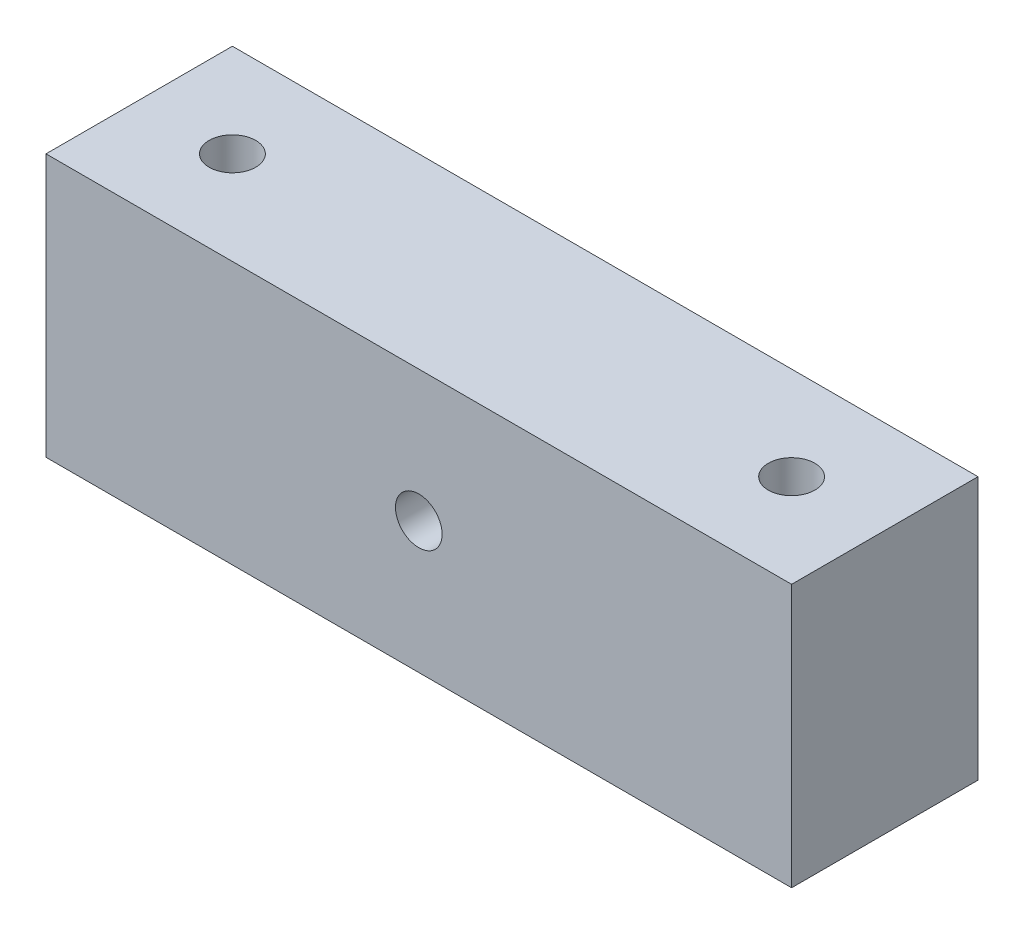
ISO-10303-21;
HEADER;
FILE_DESCRIPTION(('STEP AP214'),'2;1');
FILE_NAME('part.step','',(''),(''),'','','');
FILE_SCHEMA(('AUTOMOTIVE_DESIGN { 1 0 10303 214 1 1 1 1 }'));
ENDSEC;
DATA;
#1=APPLICATION_CONTEXT('core data for automotive mechanical design processes');
#2=APPLICATION_PROTOCOL_DEFINITION('international standard','automotive_design',2000,#1);
#3=PRODUCT_CONTEXT('',#1,'mechanical');
#4=PRODUCT('Part','Part','',(#3));
#5=PRODUCT_RELATED_PRODUCT_CATEGORY('part','',(#4));
#6=PRODUCT_DEFINITION_FORMATION('','',#4);
#7=PRODUCT_DEFINITION_CONTEXT('part definition',#1,'design');
#8=PRODUCT_DEFINITION('design','',#6,#7);
#9=PRODUCT_DEFINITION_SHAPE('','',#8);
#10=(LENGTH_UNIT() NAMED_UNIT(*) SI_UNIT(.MILLI.,.METRE.));
#11=(NAMED_UNIT(*) PLANE_ANGLE_UNIT() SI_UNIT($,.RADIAN.));
#12=(NAMED_UNIT(*) SI_UNIT($,.STERADIAN.) SOLID_ANGLE_UNIT());
#13=UNCERTAINTY_MEASURE_WITH_UNIT(LENGTH_MEASURE(1.E-05),#10,'distance_accuracy_value','');
#14=(GEOMETRIC_REPRESENTATION_CONTEXT(3) GLOBAL_UNCERTAINTY_ASSIGNED_CONTEXT((#13)) GLOBAL_UNIT_ASSIGNED_CONTEXT((#10,
#11,#12)) REPRESENTATION_CONTEXT('',''));
#15=CARTESIAN_POINT('',(0.,0.,0.));
#16=DIRECTION('',(0.,0.,1.));
#17=DIRECTION('',(1.,0.,0.));
#18=AXIS2_PLACEMENT_3D('',#15,#16,#17);
#19=CARTESIAN_POINT('',(0.,14.1,0.));
#20=DIRECTION('',(1.,0.,0.));
#21=DIRECTION('',(0.,0.,1.));
#22=AXIS2_PLACEMENT_3D('',#19,#20,#21);
#23=PLANE('',#22);
#24=DIRECTION('',(0.,0.,-1.));
#25=VECTOR('',#24,1.);
#26=CARTESIAN_POINT('',(0.,0.,0.));
#27=LINE('',#26,#25);
#28=CARTESIAN_POINT('',(0.,0.,10.));
#29=VERTEX_POINT('',#28);
#30=CARTESIAN_POINT('',(0.,0.,0.));
#31=VERTEX_POINT('',#30);
#32=EDGE_CURVE('E101',#29,#31,#27,.T.);
#33=ORIENTED_EDGE('',*,*,#32,.F.);
#34=DIRECTION('',(0.,-1.,0.));
#35=VECTOR('',#34,1.);
#36=CARTESIAN_POINT('',(0.,14.1,10.));
#37=LINE('',#36,#35);
#38=CARTESIAN_POINT('',(0.,14.1,10.));
#39=VERTEX_POINT('',#38);
#40=EDGE_CURVE('E100',#39,#29,#37,.T.);
#41=ORIENTED_EDGE('',*,*,#40,.F.);
#42=DIRECTION('',(0.,0.,-1.));
#43=VECTOR('',#42,1.);
#44=CARTESIAN_POINT('',(0.,14.1,0.));
#45=LINE('',#44,#43);
#46=CARTESIAN_POINT('',(0.,14.1,0.));
#47=VERTEX_POINT('',#46);
#48=EDGE_CURVE('E94',#39,#47,#45,.T.);
#49=ORIENTED_EDGE('',*,*,#48,.T.);
#50=DIRECTION('',(0.,-1.,0.));
#51=VECTOR('',#50,1.);
#52=CARTESIAN_POINT('',(0.,14.1,0.));
#53=LINE('',#52,#51);
#54=EDGE_CURVE('E11',#47,#31,#53,.T.);
#55=ORIENTED_EDGE('',*,*,#54,.T.);
#56=EDGE_LOOP('',(#33,#41,#49,#55));
#57=FACE_BOUND('',#56,.T.);
#58=ADVANCED_FACE('F37',(#57),#23,.F.);
#59=CARTESIAN_POINT('',(0.,14.1,0.));
#60=DIRECTION('',(0.,0.,1.));
#61=DIRECTION('',(-1.,0.,0.));
#62=AXIS2_PLACEMENT_3D('',#59,#60,#61);
#63=PLANE('',#62);
#64=CARTESIAN_POINT('',(20.,7.05,0.));
#65=DIRECTION('',(0.,0.,-1.));
#66=DIRECTION('',(-1.,0.,0.));
#67=AXIS2_PLACEMENT_3D('',#64,#65,#66);
#68=CIRCLE('',#67,1.25);
#69=CARTESIAN_POINT('',(18.75,7.05,0.));
#70=VERTEX_POINT('',#69);
#71=EDGE_CURVE('E135',#70,#70,#68,.T.);
#72=ORIENTED_EDGE('',*,*,#71,.F.);
#73=EDGE_LOOP('',(#72));
#74=FACE_BOUND('',#73,.T.);
#75=DIRECTION('',(1.,0.,0.));
#76=VECTOR('',#75,1.);
#77=CARTESIAN_POINT('',(0.,0.,0.));
#78=LINE('',#77,#76);
#79=CARTESIAN_POINT('',(40.,0.,0.));
#80=VERTEX_POINT('',#79);
#81=EDGE_CURVE('E103',#31,#80,#78,.T.);
#82=ORIENTED_EDGE('',*,*,#81,.F.);
#83=ORIENTED_EDGE('',*,*,#54,.F.);
#84=DIRECTION('',(1.,0.,0.));
#85=VECTOR('',#84,1.);
#86=CARTESIAN_POINT('',(0.,14.1,0.));
#87=LINE('',#86,#85);
#88=CARTESIAN_POINT('',(40.,14.1,0.));
#89=VERTEX_POINT('',#88);
#90=EDGE_CURVE('E78',#47,#89,#87,.T.);
#91=ORIENTED_EDGE('',*,*,#90,.T.);
#92=DIRECTION('',(0.,-1.,0.));
#93=VECTOR('',#92,1.);
#94=CARTESIAN_POINT('',(40.,14.1,0.));
#95=LINE('',#94,#93);
#96=EDGE_CURVE('E45',#89,#80,#95,.T.);
#97=ORIENTED_EDGE('',*,*,#96,.T.);
#98=EDGE_LOOP('',(#82,#83,#91,#97));
#99=FACE_BOUND('',#98,.T.);
#100=ADVANCED_FACE('F92',(#74,#99),#63,.F.);
#101=CARTESIAN_POINT('',(40.,14.1,0.));
#102=DIRECTION('',(-1.,0.,0.));
#103=DIRECTION('',(0.,0.,-1.));
#104=AXIS2_PLACEMENT_3D('',#101,#102,#103);
#105=PLANE('',#104);
#106=DIRECTION('',(0.,0.,1.));
#107=VECTOR('',#106,1.);
#108=CARTESIAN_POINT('',(40.,0.,0.));
#109=LINE('',#108,#107);
#110=CARTESIAN_POINT('',(40.,0.,10.));
#111=VERTEX_POINT('',#110);
#112=EDGE_CURVE('E88',#80,#111,#109,.T.);
#113=ORIENTED_EDGE('',*,*,#112,.F.);
#114=ORIENTED_EDGE('',*,*,#96,.F.);
#115=DIRECTION('',(0.,0.,1.));
#116=VECTOR('',#115,1.);
#117=CARTESIAN_POINT('',(40.,14.1,0.));
#118=LINE('',#117,#116);
#119=CARTESIAN_POINT('',(40.,14.1,10.));
#120=VERTEX_POINT('',#119);
#121=EDGE_CURVE('E81',#89,#120,#118,.T.);
#122=ORIENTED_EDGE('',*,*,#121,.T.);
#123=DIRECTION('',(0.,-1.,0.));
#124=VECTOR('',#123,1.);
#125=CARTESIAN_POINT('',(40.,14.1,10.));
#126=LINE('',#125,#124);
#127=EDGE_CURVE('E91',#120,#111,#126,.T.);
#128=ORIENTED_EDGE('',*,*,#127,.T.);
#129=EDGE_LOOP('',(#113,#114,#122,#128));
#130=FACE_BOUND('',#129,.T.);
#131=ADVANCED_FACE('F87',(#130),#105,.F.);
#132=CARTESIAN_POINT('',(0.,14.1,10.));
#133=DIRECTION('',(0.,0.,-1.));
#134=DIRECTION('',(1.,0.,0.));
#135=AXIS2_PLACEMENT_3D('',#132,#133,#134);
#136=PLANE('',#135);
#137=CARTESIAN_POINT('',(20.,7.05,10.));
#138=DIRECTION('',(0.,0.,-1.));
#139=DIRECTION('',(-1.,0.,0.));
#140=AXIS2_PLACEMENT_3D('',#137,#138,#139);
#141=CIRCLE('',#140,1.25);
#142=CARTESIAN_POINT('',(18.75,7.05,10.));
#143=VERTEX_POINT('',#142);
#144=EDGE_CURVE('E138',#143,#143,#141,.T.);
#145=ORIENTED_EDGE('',*,*,#144,.T.);
#146=EDGE_LOOP('',(#145));
#147=FACE_BOUND('',#146,.T.);
#148=DIRECTION('',(-1.,0.,0.));
#149=VECTOR('',#148,1.);
#150=CARTESIAN_POINT('',(0.,0.,10.));
#151=LINE('',#150,#149);
#152=EDGE_CURVE('E67',#111,#29,#151,.T.);
#153=ORIENTED_EDGE('',*,*,#152,.F.);
#154=ORIENTED_EDGE('',*,*,#127,.F.);
#155=DIRECTION('',(-1.,0.,0.));
#156=VECTOR('',#155,1.);
#157=CARTESIAN_POINT('',(0.,14.1,10.));
#158=LINE('',#157,#156);
#159=EDGE_CURVE('E53',#120,#39,#158,.T.);
#160=ORIENTED_EDGE('',*,*,#159,.T.);
#161=ORIENTED_EDGE('',*,*,#40,.T.);
#162=EDGE_LOOP('',(#153,#154,#160,#161));
#163=FACE_BOUND('',#162,.T.);
#164=ADVANCED_FACE('F113',(#147,#163),#136,.F.);
#165=CARTESIAN_POINT('',(0.,14.1,0.));
#166=DIRECTION('',(0.,-1.,0.));
#167=DIRECTION('',(0.,0.,1.));
#168=AXIS2_PLACEMENT_3D('',#165,#166,#167);
#169=PLANE('',#168);
#170=CARTESIAN_POINT('',(5.,14.1,5.));
#171=DIRECTION('',(0.,-1.,0.));
#172=DIRECTION('',(0.,0.,-1.));
#173=AXIS2_PLACEMENT_3D('',#170,#171,#172);
#174=CIRCLE('',#173,1.25);
#175=CARTESIAN_POINT('',(5.,14.1,3.75));
#176=VERTEX_POINT('',#175);
#177=EDGE_CURVE('E137',#176,#176,#174,.T.);
#178=ORIENTED_EDGE('',*,*,#177,.T.);
#179=EDGE_LOOP('',(#178));
#180=FACE_BOUND('',#179,.T.);
#181=CARTESIAN_POINT('',(35.,14.1,5.));
#182=DIRECTION('',(0.,-1.,0.));
#183=DIRECTION('',(0.,0.,-1.));
#184=AXIS2_PLACEMENT_3D('',#181,#182,#183);
#185=CIRCLE('',#184,1.25);
#186=CARTESIAN_POINT('',(35.,14.1,3.75));
#187=VERTEX_POINT('',#186);
#188=EDGE_CURVE('E147',#187,#187,#185,.T.);
#189=ORIENTED_EDGE('',*,*,#188,.T.);
#190=EDGE_LOOP('',(#189));
#191=FACE_BOUND('',#190,.T.);
#192=ORIENTED_EDGE('',*,*,#48,.F.);
#193=ORIENTED_EDGE('',*,*,#159,.F.);
#194=ORIENTED_EDGE('',*,*,#121,.F.);
#195=ORIENTED_EDGE('',*,*,#90,.F.);
#196=EDGE_LOOP('',(#192,#193,#194,#195));
#197=FACE_BOUND('',#196,.T.);
#198=ADVANCED_FACE('F83',(#180,#191,#197),#169,.F.);
#199=CARTESIAN_POINT('',(0.,0.,0.));
#200=DIRECTION('',(0.,-1.,0.));
#201=DIRECTION('',(0.,0.,1.));
#202=AXIS2_PLACEMENT_3D('',#199,#200,#201);
#203=PLANE('',#202);
#204=CARTESIAN_POINT('',(5.,0.,5.));
#205=DIRECTION('',(0.,-1.,0.));
#206=DIRECTION('',(0.,0.,-1.));
#207=AXIS2_PLACEMENT_3D('',#204,#205,#206);
#208=CIRCLE('',#207,1.25);
#209=CARTESIAN_POINT('',(5.,0.,3.75));
#210=VERTEX_POINT('',#209);
#211=EDGE_CURVE('E141',#210,#210,#208,.T.);
#212=ORIENTED_EDGE('',*,*,#211,.F.);
#213=EDGE_LOOP('',(#212));
#214=FACE_BOUND('',#213,.T.);
#215=CARTESIAN_POINT('',(35.,0.,5.));
#216=DIRECTION('',(0.,-1.,0.));
#217=DIRECTION('',(0.,0.,-1.));
#218=AXIS2_PLACEMENT_3D('',#215,#216,#217);
#219=CIRCLE('',#218,1.24999999999999);
#220=CARTESIAN_POINT('',(35.,0.,3.75000000000001));
#221=VERTEX_POINT('',#220);
#222=EDGE_CURVE('E104',#221,#221,#219,.T.);
#223=ORIENTED_EDGE('',*,*,#222,.F.);
#224=EDGE_LOOP('',(#223));
#225=FACE_BOUND('',#224,.T.);
#226=ORIENTED_EDGE('',*,*,#32,.T.);
#227=ORIENTED_EDGE('',*,*,#81,.T.);
#228=ORIENTED_EDGE('',*,*,#112,.T.);
#229=ORIENTED_EDGE('',*,*,#152,.T.);
#230=EDGE_LOOP('',(#226,#227,#228,#229));
#231=FACE_BOUND('',#230,.T.);
#232=ADVANCED_FACE('F109',(#214,#225,#231),#203,.T.);
#233=CARTESIAN_POINT('',(35.,14.1,5.));
#234=DIRECTION('',(0.,1.,0.));
#235=DIRECTION('',(0.,0.,-1.));
#236=AXIS2_PLACEMENT_3D('',#233,#234,#235);
#237=CYLINDRICAL_SURFACE('',#236,1.25);
#238=ORIENTED_EDGE('',*,*,#222,.T.);
#239=EDGE_LOOP('',(#238));
#240=FACE_BOUND('',#239,.T.);
#241=ORIENTED_EDGE('',*,*,#188,.F.);
#242=EDGE_LOOP('',(#241));
#243=FACE_BOUND('',#242,.T.);
#244=ADVANCED_FACE('F152',(#240,#243),#237,.F.);
#245=CARTESIAN_POINT('',(5.,14.1,5.));
#246=DIRECTION('',(0.,1.,0.));
#247=DIRECTION('',(0.,0.,-1.));
#248=AXIS2_PLACEMENT_3D('',#245,#246,#247);
#249=CYLINDRICAL_SURFACE('',#248,1.25);
#250=ORIENTED_EDGE('',*,*,#211,.T.);
#251=EDGE_LOOP('',(#250));
#252=FACE_BOUND('',#251,.T.);
#253=ORIENTED_EDGE('',*,*,#177,.F.);
#254=EDGE_LOOP('',(#253));
#255=FACE_BOUND('',#254,.T.);
#256=ADVANCED_FACE('F160',(#252,#255),#249,.F.);
#257=CARTESIAN_POINT('',(20.,7.05,10.));
#258=DIRECTION('',(0.,0.,1.));
#259=DIRECTION('',(-1.,0.,0.));
#260=AXIS2_PLACEMENT_3D('',#257,#258,#259);
#261=CYLINDRICAL_SURFACE('',#260,1.25);
#262=ORIENTED_EDGE('',*,*,#71,.T.);
#263=EDGE_LOOP('',(#262));
#264=FACE_BOUND('',#263,.T.);
#265=ORIENTED_EDGE('',*,*,#144,.F.);
#266=EDGE_LOOP('',(#265));
#267=FACE_BOUND('',#266,.T.);
#268=ADVANCED_FACE('F166',(#264,#267),#261,.F.);
#269=CLOSED_SHELL('',(#58,#100,#131,#164,#198,#232,#244,#256,#268));
#270=MANIFOLD_SOLID_BREP('B2',#269);
#271=ADVANCED_BREP_SHAPE_REPRESENTATION('',(#18,#270),#14);
#272=SHAPE_DEFINITION_REPRESENTATION(#9,#271);
ENDSEC;
END-ISO-10303-21;
